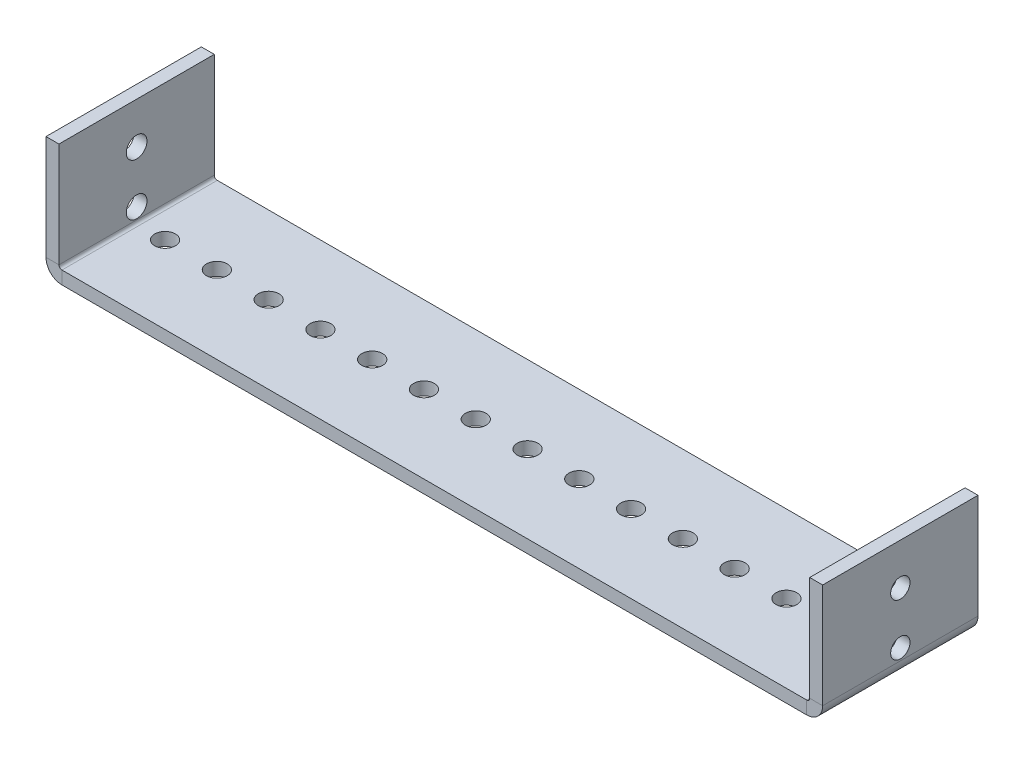
ISO-10303-21;
HEADER;
FILE_DESCRIPTION(('STEP AP214'),'2;1');
FILE_NAME('part.step','',(''),(''),'','','');
FILE_SCHEMA(('AUTOMOTIVE_DESIGN { 1 0 10303 214 1 1 1 1 }'));
ENDSEC;
DATA;
#1=APPLICATION_CONTEXT('core data for automotive mechanical design processes');
#2=APPLICATION_PROTOCOL_DEFINITION('international standard','automotive_design',2000,#1);
#3=PRODUCT_CONTEXT('',#1,'mechanical');
#4=PRODUCT('Part','Part','',(#3));
#5=PRODUCT_RELATED_PRODUCT_CATEGORY('part','',(#4));
#6=PRODUCT_DEFINITION_FORMATION('','',#4);
#7=PRODUCT_DEFINITION_CONTEXT('part definition',#1,'design');
#8=PRODUCT_DEFINITION('design','',#6,#7);
#9=PRODUCT_DEFINITION_SHAPE('','',#8);
#10=(LENGTH_UNIT() NAMED_UNIT(*) SI_UNIT(.MILLI.,.METRE.));
#11=(NAMED_UNIT(*) PLANE_ANGLE_UNIT() SI_UNIT($,.RADIAN.));
#12=(NAMED_UNIT(*) SI_UNIT($,.STERADIAN.) SOLID_ANGLE_UNIT());
#13=UNCERTAINTY_MEASURE_WITH_UNIT(LENGTH_MEASURE(1.E-05),#10,'distance_accuracy_value','');
#14=(GEOMETRIC_REPRESENTATION_CONTEXT(3) GLOBAL_UNCERTAINTY_ASSIGNED_CONTEXT((#13)) GLOBAL_UNIT_ASSIGNED_CONTEXT((#10,
#11,#12)) REPRESENTATION_CONTEXT('',''));
#15=CARTESIAN_POINT('',(0.,0.,0.));
#16=DIRECTION('',(0.,0.,1.));
#17=DIRECTION('',(1.,0.,0.));
#18=AXIS2_PLACEMENT_3D('',#15,#16,#17);
#19=CARTESIAN_POINT('',(0.,0.,0.));
#20=DIRECTION('',(0.,1.,0.));
#21=DIRECTION('',(0.,0.,1.));
#22=AXIS2_PLACEMENT_3D('',#19,#20,#21);
#23=PLANE('',#22);
#24=CARTESIAN_POINT('',(-85.09,0.,0.));
#25=DIRECTION('',(0.,1.,0.));
#26=DIRECTION('',(0.,0.,1.));
#27=AXIS2_PLACEMENT_3D('',#24,#25,#26);
#28=CIRCLE('',#27,2.54);
#29=CARTESIAN_POINT('',(-85.09,0.,2.53999999999999));
#30=VERTEX_POINT('',#29);
#31=EDGE_CURVE('E252',#30,#30,#28,.T.);
#32=ORIENTED_EDGE('',*,*,#31,.T.);
#33=EDGE_LOOP('',(#32));
#34=FACE_BOUND('',#33,.T.);
#35=CARTESIAN_POINT('',(-72.39,0.,0.));
#36=DIRECTION('',(0.,1.,0.));
#37=DIRECTION('',(0.,0.,1.));
#38=AXIS2_PLACEMENT_3D('',#35,#36,#37);
#39=CIRCLE('',#38,2.54);
#40=CARTESIAN_POINT('',(-72.39,0.,2.53999999999999));
#41=VERTEX_POINT('',#40);
#42=EDGE_CURVE('E249',#41,#41,#39,.T.);
#43=ORIENTED_EDGE('',*,*,#42,.T.);
#44=EDGE_LOOP('',(#43));
#45=FACE_BOUND('',#44,.T.);
#46=CARTESIAN_POINT('',(-59.69,0.,0.));
#47=DIRECTION('',(0.,1.,0.));
#48=DIRECTION('',(0.,0.,1.));
#49=AXIS2_PLACEMENT_3D('',#46,#47,#48);
#50=CIRCLE('',#49,2.54);
#51=CARTESIAN_POINT('',(-59.69,0.,2.53999999999999));
#52=VERTEX_POINT('',#51);
#53=EDGE_CURVE('E246',#52,#52,#50,.T.);
#54=ORIENTED_EDGE('',*,*,#53,.T.);
#55=EDGE_LOOP('',(#54));
#56=FACE_BOUND('',#55,.T.);
#57=CARTESIAN_POINT('',(-46.99,0.,0.));
#58=DIRECTION('',(0.,1.,0.));
#59=DIRECTION('',(0.,0.,1.));
#60=AXIS2_PLACEMENT_3D('',#57,#58,#59);
#61=CIRCLE('',#60,2.54);
#62=CARTESIAN_POINT('',(-46.99,0.,2.53999999999999));
#63=VERTEX_POINT('',#62);
#64=EDGE_CURVE('E243',#63,#63,#61,.T.);
#65=ORIENTED_EDGE('',*,*,#64,.T.);
#66=EDGE_LOOP('',(#65));
#67=FACE_BOUND('',#66,.T.);
#68=CARTESIAN_POINT('',(-34.29,0.,0.));
#69=DIRECTION('',(0.,1.,0.));
#70=DIRECTION('',(0.,0.,1.));
#71=AXIS2_PLACEMENT_3D('',#68,#69,#70);
#72=CIRCLE('',#71,2.54);
#73=CARTESIAN_POINT('',(-34.29,0.,2.53999999999999));
#74=VERTEX_POINT('',#73);
#75=EDGE_CURVE('E240',#74,#74,#72,.T.);
#76=ORIENTED_EDGE('',*,*,#75,.T.);
#77=EDGE_LOOP('',(#76));
#78=FACE_BOUND('',#77,.T.);
#79=CARTESIAN_POINT('',(-21.59,0.,0.));
#80=DIRECTION('',(0.,1.,0.));
#81=DIRECTION('',(0.,0.,1.));
#82=AXIS2_PLACEMENT_3D('',#79,#80,#81);
#83=CIRCLE('',#82,2.54);
#84=CARTESIAN_POINT('',(-21.59,0.,2.53999999999999));
#85=VERTEX_POINT('',#84);
#86=EDGE_CURVE('E237',#85,#85,#83,.T.);
#87=ORIENTED_EDGE('',*,*,#86,.T.);
#88=EDGE_LOOP('',(#87));
#89=FACE_BOUND('',#88,.T.);
#90=CARTESIAN_POINT('',(-8.88999999999997,0.,0.));
#91=DIRECTION('',(0.,1.,0.));
#92=DIRECTION('',(0.,0.,1.));
#93=AXIS2_PLACEMENT_3D('',#90,#91,#92);
#94=CIRCLE('',#93,2.54);
#95=CARTESIAN_POINT('',(-8.88999999999997,0.,2.53999999999999));
#96=VERTEX_POINT('',#95);
#97=EDGE_CURVE('E234',#96,#96,#94,.T.);
#98=ORIENTED_EDGE('',*,*,#97,.T.);
#99=EDGE_LOOP('',(#98));
#100=FACE_BOUND('',#99,.T.);
#101=CARTESIAN_POINT('',(3.81000000000004,0.,0.));
#102=DIRECTION('',(0.,1.,0.));
#103=DIRECTION('',(0.,0.,1.));
#104=AXIS2_PLACEMENT_3D('',#101,#102,#103);
#105=CIRCLE('',#104,2.54);
#106=CARTESIAN_POINT('',(3.81000000000004,0.,2.53999999999999));
#107=VERTEX_POINT('',#106);
#108=EDGE_CURVE('E231',#107,#107,#105,.T.);
#109=ORIENTED_EDGE('',*,*,#108,.T.);
#110=EDGE_LOOP('',(#109));
#111=FACE_BOUND('',#110,.T.);
#112=CARTESIAN_POINT('',(16.51,0.,0.));
#113=DIRECTION('',(0.,1.,0.));
#114=DIRECTION('',(0.,0.,1.));
#115=AXIS2_PLACEMENT_3D('',#112,#113,#114);
#116=CIRCLE('',#115,2.54);
#117=CARTESIAN_POINT('',(16.51,0.,2.53999999999999));
#118=VERTEX_POINT('',#117);
#119=EDGE_CURVE('E228',#118,#118,#116,.T.);
#120=ORIENTED_EDGE('',*,*,#119,.T.);
#121=EDGE_LOOP('',(#120));
#122=FACE_BOUND('',#121,.T.);
#123=CARTESIAN_POINT('',(29.21,0.,0.));
#124=DIRECTION('',(0.,1.,0.));
#125=DIRECTION('',(0.,0.,1.));
#126=AXIS2_PLACEMENT_3D('',#123,#124,#125);
#127=CIRCLE('',#126,2.54);
#128=CARTESIAN_POINT('',(29.21,0.,2.53999999999999));
#129=VERTEX_POINT('',#128);
#130=EDGE_CURVE('E225',#129,#129,#127,.T.);
#131=ORIENTED_EDGE('',*,*,#130,.T.);
#132=EDGE_LOOP('',(#131));
#133=FACE_BOUND('',#132,.T.);
#134=CARTESIAN_POINT('',(41.91,0.,0.));
#135=DIRECTION('',(0.,1.,0.));
#136=DIRECTION('',(0.,0.,1.));
#137=AXIS2_PLACEMENT_3D('',#134,#135,#136);
#138=CIRCLE('',#137,2.54);
#139=CARTESIAN_POINT('',(41.91,0.,2.53999999999999));
#140=VERTEX_POINT('',#139);
#141=EDGE_CURVE('E222',#140,#140,#138,.T.);
#142=ORIENTED_EDGE('',*,*,#141,.T.);
#143=EDGE_LOOP('',(#142));
#144=FACE_BOUND('',#143,.T.);
#145=CARTESIAN_POINT('',(54.61,0.,0.));
#146=DIRECTION('',(0.,1.,0.));
#147=DIRECTION('',(0.,0.,1.));
#148=AXIS2_PLACEMENT_3D('',#145,#146,#147);
#149=CIRCLE('',#148,2.54);
#150=CARTESIAN_POINT('',(54.61,0.,2.53999999999999));
#151=VERTEX_POINT('',#150);
#152=EDGE_CURVE('E219',#151,#151,#149,.T.);
#153=ORIENTED_EDGE('',*,*,#152,.T.);
#154=EDGE_LOOP('',(#153));
#155=FACE_BOUND('',#154,.T.);
#156=CARTESIAN_POINT('',(67.31,0.,0.));
#157=DIRECTION('',(0.,1.,0.));
#158=DIRECTION('',(0.,0.,1.));
#159=AXIS2_PLACEMENT_3D('',#156,#157,#158);
#160=CIRCLE('',#159,2.54);
#161=CARTESIAN_POINT('',(67.31,0.,2.53999999999999));
#162=VERTEX_POINT('',#161);
#163=EDGE_CURVE('E216',#162,#162,#160,.T.);
#164=ORIENTED_EDGE('',*,*,#163,.T.);
#165=EDGE_LOOP('',(#164));
#166=FACE_BOUND('',#165,.T.);
#167=CARTESIAN_POINT('',(80.01,0.,0.));
#168=DIRECTION('',(0.,1.,0.));
#169=DIRECTION('',(0.,0.,1.));
#170=AXIS2_PLACEMENT_3D('',#167,#168,#169);
#171=CIRCLE('',#170,2.54);
#172=CARTESIAN_POINT('',(80.01,0.,2.53999999999999));
#173=VERTEX_POINT('',#172);
#174=EDGE_CURVE('E213',#173,#173,#171,.T.);
#175=ORIENTED_EDGE('',*,*,#174,.T.);
#176=EDGE_LOOP('',(#175));
#177=FACE_BOUND('',#176,.T.);
#178=DIRECTION('',(1.,0.,0.));
#179=VECTOR('',#178,1.);
#180=CARTESIAN_POINT('',(-120.65,0.,-19.05));
#181=LINE('',#180,#179);
#182=CARTESIAN_POINT('',(-91.3384,0.,-19.05));
#183=VERTEX_POINT('',#182);
#184=CARTESIAN_POINT('',(91.3384,0.,-19.05));
#185=VERTEX_POINT('',#184);
#186=EDGE_CURVE('E63',#183,#185,#181,.T.);
#187=ORIENTED_EDGE('',*,*,#186,.T.);
#188=DIRECTION('',(0.,0.,1.));
#189=VECTOR('',#188,1.);
#190=CARTESIAN_POINT('',(91.3384,0.,0.));
#191=LINE('',#190,#189);
#192=CARTESIAN_POINT('',(91.3384,0.,19.05));
#193=VERTEX_POINT('',#192);
#194=EDGE_CURVE('E55',#185,#193,#191,.T.);
#195=ORIENTED_EDGE('',*,*,#194,.T.);
#196=DIRECTION('',(1.,0.,0.));
#197=VECTOR('',#196,1.);
#198=CARTESIAN_POINT('',(-120.65,0.,19.05));
#199=LINE('',#198,#197);
#200=CARTESIAN_POINT('',(-91.3384,0.,19.05));
#201=VERTEX_POINT('',#200);
#202=EDGE_CURVE('E71',#201,#193,#199,.T.);
#203=ORIENTED_EDGE('',*,*,#202,.F.);
#204=DIRECTION('',(0.,0.,1.));
#205=VECTOR('',#204,1.);
#206=CARTESIAN_POINT('',(-91.3384,0.,0.));
#207=LINE('',#206,#205);
#208=EDGE_CURVE('E204',#183,#201,#207,.T.);
#209=ORIENTED_EDGE('',*,*,#208,.F.);
#210=EDGE_LOOP('',(#187,#195,#203,#209));
#211=FACE_BOUND('',#210,.T.);
#212=ADVANCED_FACE('F46',(#34,#45,#56,#67,#78,#89,#100,#111,#122,#133,#144,#155,#166,#177,#211),
#23,.F.);
#213=CARTESIAN_POINT('',(-120.65,3.175,19.05));
#214=DIRECTION('',(0.,0.,-1.));
#215=DIRECTION('',(-1.,0.,0.));
#216=AXIS2_PLACEMENT_3D('',#213,#214,#215);
#217=PLANE('',#216);
#218=ORIENTED_EDGE('',*,*,#202,.T.);
#219=DIRECTION('',(0.,1.,0.));
#220=VECTOR('',#219,1.);
#221=CARTESIAN_POINT('',(91.3384,3.175,19.05));
#222=LINE('',#221,#220);
#223=CARTESIAN_POINT('',(91.3384,3.175,19.05));
#224=VERTEX_POINT('',#223);
#225=EDGE_CURVE('E352',#193,#224,#222,.T.);
#226=ORIENTED_EDGE('',*,*,#225,.T.);
#227=DIRECTION('',(1.,0.,0.));
#228=VECTOR('',#227,1.);
#229=CARTESIAN_POINT('',(-120.65,3.175,19.05));
#230=LINE('',#229,#228);
#231=CARTESIAN_POINT('',(-91.3384,3.175,19.05));
#232=VERTEX_POINT('',#231);
#233=EDGE_CURVE('E258',#232,#224,#230,.T.);
#234=ORIENTED_EDGE('',*,*,#233,.F.);
#235=DIRECTION('',(0.,1.,0.));
#236=VECTOR('',#235,1.);
#237=CARTESIAN_POINT('',(-91.3384,3.175,19.05));
#238=LINE('',#237,#236);
#239=EDGE_CURVE('E301',#201,#232,#238,.T.);
#240=ORIENTED_EDGE('',*,*,#239,.F.);
#241=EDGE_LOOP('',(#218,#226,#234,#240));
#242=FACE_BOUND('',#241,.T.);
#243=ADVANCED_FACE('F388',(#242),#217,.F.);
#244=CARTESIAN_POINT('',(-92.0749999999999,29.5725122568959,19.05));
#245=DIRECTION('',(0.,0.,-1.));
#246=DIRECTION('',(0.,1.,0.));
#247=AXIS2_PLACEMENT_3D('',#244,#245,#246);
#248=PLANE('',#247);
#249=DIRECTION('',(0.,-1.,0.));
#250=VECTOR('',#249,1.);
#251=CARTESIAN_POINT('',(-95.2499999999999,29.5725122568959,19.05));
#252=LINE('',#251,#250);
#253=CARTESIAN_POINT('',(-95.2499999999999,29.5725122568959,19.05));
#254=VERTEX_POINT('',#253);
#255=CARTESIAN_POINT('',(-95.25,3.91160000000002,19.05));
#256=VERTEX_POINT('',#255);
#257=EDGE_CURVE('E328',#254,#256,#252,.T.);
#258=ORIENTED_EDGE('',*,*,#257,.T.);
#259=DIRECTION('',(1.,0.,0.));
#260=VECTOR('',#259,1.);
#261=CARTESIAN_POINT('',(-92.075,3.91159999999999,19.05));
#262=LINE('',#261,#260);
#263=CARTESIAN_POINT('',(-92.075,3.91160000000001,19.05));
#264=VERTEX_POINT('',#263);
#265=EDGE_CURVE('E335',#256,#264,#262,.T.);
#266=ORIENTED_EDGE('',*,*,#265,.T.);
#267=DIRECTION('',(0.,-1.,0.));
#268=VECTOR('',#267,1.);
#269=CARTESIAN_POINT('',(-92.0749999999999,29.5725122568959,19.05));
#270=LINE('',#269,#268);
#271=CARTESIAN_POINT('',(-92.0749999999999,29.5725122568959,19.05));
#272=VERTEX_POINT('',#271);
#273=EDGE_CURVE('E323',#272,#264,#270,.T.);
#274=ORIENTED_EDGE('',*,*,#273,.F.);
#275=DIRECTION('',(-1.,0.,0.));
#276=VECTOR('',#275,1.);
#277=CARTESIAN_POINT('',(-92.0749999999999,29.5725122568959,19.05));
#278=LINE('',#277,#276);
#279=EDGE_CURVE('E322',#272,#254,#278,.T.);
#280=ORIENTED_EDGE('',*,*,#279,.T.);
#281=EDGE_LOOP('',(#258,#266,#274,#280));
#282=FACE_BOUND('',#281,.T.);
#283=ADVANCED_FACE('F393',(#282),#248,.F.);
#284=CARTESIAN_POINT('',(-95.2500000000004,-91.077487743104,0.));
#285=DIRECTION('',(1.,0.,0.));
#286=DIRECTION('',(0.,0.,1.));
#287=AXIS2_PLACEMENT_3D('',#284,#285,#286);
#288=PLANE('',#287);
#289=CARTESIAN_POINT('',(-95.25,19.4125122568959,0.));
#290=DIRECTION('',(1.,0.,0.));
#291=DIRECTION('',(0.,0.,1.));
#292=AXIS2_PLACEMENT_3D('',#289,#290,#291);
#293=CIRCLE('',#292,2.54);
#294=CARTESIAN_POINT('',(-95.25,19.4125122568959,2.53999999999999));
#295=VERTEX_POINT('',#294);
#296=EDGE_CURVE('E313',#295,#295,#293,.T.);
#297=ORIENTED_EDGE('',*,*,#296,.T.);
#298=EDGE_LOOP('',(#297));
#299=FACE_BOUND('',#298,.T.);
#300=CARTESIAN_POINT('',(-95.25,6.71251225689593,0.));
#301=DIRECTION('',(1.,0.,0.));
#302=DIRECTION('',(0.,0.,1.));
#303=AXIS2_PLACEMENT_3D('',#300,#301,#302);
#304=CIRCLE('',#303,2.54);
#305=CARTESIAN_POINT('',(-95.25,6.71251225689593,2.53999999999999));
#306=VERTEX_POINT('',#305);
#307=EDGE_CURVE('E306',#306,#306,#304,.T.);
#308=ORIENTED_EDGE('',*,*,#307,.T.);
#309=EDGE_LOOP('',(#308));
#310=FACE_BOUND('',#309,.T.);
#311=DIRECTION('',(0.,-1.,0.));
#312=VECTOR('',#311,1.);
#313=CARTESIAN_POINT('',(-95.2499999999999,29.5725122568959,-19.05));
#314=LINE('',#313,#312);
#315=CARTESIAN_POINT('',(-95.2499999999999,29.5725122568959,-19.05));
#316=VERTEX_POINT('',#315);
#317=CARTESIAN_POINT('',(-95.25,3.91160000000002,-19.05));
#318=VERTEX_POINT('',#317);
#319=EDGE_CURVE('E316',#316,#318,#314,.T.);
#320=ORIENTED_EDGE('',*,*,#319,.T.);
#321=DIRECTION('',(0.,0.,1.));
#322=VECTOR('',#321,1.);
#323=CARTESIAN_POINT('',(-95.25,3.9116,0.));
#324=LINE('',#323,#322);
#325=EDGE_CURVE('E337',#318,#256,#324,.T.);
#326=ORIENTED_EDGE('',*,*,#325,.T.);
#327=ORIENTED_EDGE('',*,*,#257,.F.);
#328=DIRECTION('',(0.,0.,-1.));
#329=VECTOR('',#328,1.);
#330=CARTESIAN_POINT('',(-95.2499999999999,29.5725122568959,19.05));
#331=LINE('',#330,#329);
#332=EDGE_CURVE('E324',#254,#316,#331,.T.);
#333=ORIENTED_EDGE('',*,*,#332,.T.);
#334=EDGE_LOOP('',(#320,#326,#327,#333));
#335=FACE_BOUND('',#334,.T.);
#336=ADVANCED_FACE('F406',(#299,#310,#335),#288,.F.);
#337=CARTESIAN_POINT('',(-92.0749999999999,29.5725122568959,-19.05));
#338=DIRECTION('',(0.,0.,-1.));
#339=DIRECTION('',(0.,1.,0.));
#340=AXIS2_PLACEMENT_3D('',#337,#338,#339);
#341=PLANE('',#340);
#342=DIRECTION('',(1.,0.,0.));
#343=VECTOR('',#342,1.);
#344=CARTESIAN_POINT('',(-92.075,3.91159999999999,-19.05));
#345=LINE('',#344,#343);
#346=CARTESIAN_POINT('',(-92.075,3.9116,-19.05));
#347=VERTEX_POINT('',#346);
#348=EDGE_CURVE('E340',#318,#347,#345,.T.);
#349=ORIENTED_EDGE('',*,*,#348,.F.);
#350=ORIENTED_EDGE('',*,*,#319,.F.);
#351=DIRECTION('',(-1.,0.,0.));
#352=VECTOR('',#351,1.);
#353=CARTESIAN_POINT('',(-92.0749999999999,29.5725122568959,-19.05));
#354=LINE('',#353,#352);
#355=CARTESIAN_POINT('',(-92.0749999999999,29.5725122568959,-19.05));
#356=VERTEX_POINT('',#355);
#357=EDGE_CURVE('E329',#356,#316,#354,.T.);
#358=ORIENTED_EDGE('',*,*,#357,.F.);
#359=DIRECTION('',(0.,-1.,0.));
#360=VECTOR('',#359,1.);
#361=CARTESIAN_POINT('',(-92.0749999999999,29.5725122568959,-19.05));
#362=LINE('',#361,#360);
#363=EDGE_CURVE('E327',#356,#347,#362,.T.);
#364=ORIENTED_EDGE('',*,*,#363,.T.);
#365=EDGE_LOOP('',(#349,#350,#358,#364));
#366=FACE_BOUND('',#365,.T.);
#367=ADVANCED_FACE('F402',(#366),#341,.T.);
#368=CARTESIAN_POINT('',(-92.0749999999999,29.5725122568959,19.05));
#369=DIRECTION('',(0.,1.,0.));
#370=DIRECTION('',(0.,0.,1.));
#371=AXIS2_PLACEMENT_3D('',#368,#369,#370);
#372=PLANE('',#371);
#373=ORIENTED_EDGE('',*,*,#332,.F.);
#374=ORIENTED_EDGE('',*,*,#279,.F.);
#375=DIRECTION('',(0.,0.,-1.));
#376=VECTOR('',#375,1.);
#377=CARTESIAN_POINT('',(-92.0749999999999,29.5725122568959,19.05));
#378=LINE('',#377,#376);
#379=EDGE_CURVE('E319',#272,#356,#378,.T.);
#380=ORIENTED_EDGE('',*,*,#379,.T.);
#381=ORIENTED_EDGE('',*,*,#357,.T.);
#382=EDGE_LOOP('',(#373,#374,#380,#381));
#383=FACE_BOUND('',#382,.T.);
#384=ADVANCED_FACE('F405',(#383),#372,.T.);
#385=CARTESIAN_POINT('',(-92.0750000000004,-91.077487743104,0.));
#386=DIRECTION('',(1.,0.,0.));
#387=DIRECTION('',(0.,0.,1.));
#388=AXIS2_PLACEMENT_3D('',#385,#386,#387);
#389=PLANE('',#388);
#390=DIRECTION('',(0.,0.,1.));
#391=VECTOR('',#390,1.);
#392=CARTESIAN_POINT('',(-92.075,3.91159999999999,0.));
#393=LINE('',#392,#391);
#394=EDGE_CURVE('E331',#347,#264,#393,.T.);
#395=ORIENTED_EDGE('',*,*,#394,.F.);
#396=ORIENTED_EDGE('',*,*,#363,.F.);
#397=ORIENTED_EDGE('',*,*,#379,.F.);
#398=ORIENTED_EDGE('',*,*,#273,.T.);
#399=EDGE_LOOP('',(#395,#396,#397,#398));
#400=FACE_BOUND('',#399,.T.);
#401=CARTESIAN_POINT('',(-92.075,6.71251225689591,0.));
#402=DIRECTION('',(1.,0.,0.));
#403=DIRECTION('',(0.,0.,1.));
#404=AXIS2_PLACEMENT_3D('',#401,#402,#403);
#405=CIRCLE('',#404,2.54);
#406=CARTESIAN_POINT('',(-92.075,6.71251225689591,2.53999999999999));
#407=VERTEX_POINT('',#406);
#408=EDGE_CURVE('E309',#407,#407,#405,.T.);
#409=ORIENTED_EDGE('',*,*,#408,.F.);
#410=EDGE_LOOP('',(#409));
#411=FACE_BOUND('',#410,.T.);
#412=CARTESIAN_POINT('',(-92.075,19.4125122568959,0.));
#413=DIRECTION('',(1.,0.,0.));
#414=DIRECTION('',(0.,0.,1.));
#415=AXIS2_PLACEMENT_3D('',#412,#413,#414);
#416=CIRCLE('',#415,2.54);
#417=CARTESIAN_POINT('',(-92.075,19.4125122568959,2.53999999999999));
#418=VERTEX_POINT('',#417);
#419=EDGE_CURVE('E312',#418,#418,#416,.T.);
#420=ORIENTED_EDGE('',*,*,#419,.F.);
#421=EDGE_LOOP('',(#420));
#422=FACE_BOUND('',#421,.T.);
#423=ADVANCED_FACE('F414',(#400,#411,#422),#389,.T.);
#424=CARTESIAN_POINT('',(-95.25,19.4125122568959,0.));
#425=DIRECTION('',(1.,0.,0.));
#426=DIRECTION('',(0.,0.,1.));
#427=AXIS2_PLACEMENT_3D('',#424,#425,#426);
#428=CYLINDRICAL_SURFACE('',#427,2.54);
#429=ORIENTED_EDGE('',*,*,#296,.F.);
#430=EDGE_LOOP('',(#429));
#431=FACE_BOUND('',#430,.T.);
#432=ORIENTED_EDGE('',*,*,#419,.T.);
#433=EDGE_LOOP('',(#432));
#434=FACE_BOUND('',#433,.T.);
#435=ADVANCED_FACE('F417',(#431,#434),#428,.F.);
#436=CARTESIAN_POINT('',(-95.25,6.71251225689593,0.));
#437=DIRECTION('',(1.,0.,0.));
#438=DIRECTION('',(0.,0.,1.));
#439=AXIS2_PLACEMENT_3D('',#436,#437,#438);
#440=CYLINDRICAL_SURFACE('',#439,2.54);
#441=ORIENTED_EDGE('',*,*,#307,.F.);
#442=EDGE_LOOP('',(#441));
#443=FACE_BOUND('',#442,.T.);
#444=ORIENTED_EDGE('',*,*,#408,.T.);
#445=EDGE_LOOP('',(#444));
#446=FACE_BOUND('',#445,.T.);
#447=ADVANCED_FACE('F424',(#443,#446),#440,.F.);
#448=CARTESIAN_POINT('',(-85.09,0.,0.));
#449=DIRECTION('',(0.,1.,0.));
#450=DIRECTION('',(0.,0.,1.));
#451=AXIS2_PLACEMENT_3D('',#448,#449,#450);
#452=CYLINDRICAL_SURFACE('',#451,2.54);
#453=ORIENTED_EDGE('',*,*,#31,.F.);
#454=EDGE_LOOP('',(#453));
#455=FACE_BOUND('',#454,.T.);
#456=CARTESIAN_POINT('',(-85.09,3.175,0.));
#457=DIRECTION('',(0.,1.,0.));
#458=DIRECTION('',(0.,0.,1.));
#459=AXIS2_PLACEMENT_3D('',#456,#457,#458);
#460=CIRCLE('',#459,2.54);
#461=CARTESIAN_POINT('',(-85.09,3.175,2.53999999999999));
#462=VERTEX_POINT('',#461);
#463=EDGE_CURVE('E298',#462,#462,#460,.T.);
#464=ORIENTED_EDGE('',*,*,#463,.T.);
#465=EDGE_LOOP('',(#464));
#466=FACE_BOUND('',#465,.T.);
#467=ADVANCED_FACE('F428',(#455,#466),#452,.F.);
#468=CARTESIAN_POINT('',(-72.39,0.,0.));
#469=DIRECTION('',(0.,1.,0.));
#470=DIRECTION('',(0.,0.,1.));
#471=AXIS2_PLACEMENT_3D('',#468,#469,#470);
#472=CYLINDRICAL_SURFACE('',#471,2.54);
#473=ORIENTED_EDGE('',*,*,#42,.F.);
#474=EDGE_LOOP('',(#473));
#475=FACE_BOUND('',#474,.T.);
#476=CARTESIAN_POINT('',(-72.39,3.175,0.));
#477=DIRECTION('',(0.,1.,0.));
#478=DIRECTION('',(0.,0.,1.));
#479=AXIS2_PLACEMENT_3D('',#476,#477,#478);
#480=CIRCLE('',#479,2.54);
#481=CARTESIAN_POINT('',(-72.39,3.175,2.53999999999999));
#482=VERTEX_POINT('',#481);
#483=EDGE_CURVE('E295',#482,#482,#480,.T.);
#484=ORIENTED_EDGE('',*,*,#483,.T.);
#485=EDGE_LOOP('',(#484));
#486=FACE_BOUND('',#485,.T.);
#487=ADVANCED_FACE('F476',(#475,#486),#472,.F.);
#488=CARTESIAN_POINT('',(-59.69,0.,0.));
#489=DIRECTION('',(0.,1.,0.));
#490=DIRECTION('',(0.,0.,1.));
#491=AXIS2_PLACEMENT_3D('',#488,#489,#490);
#492=CYLINDRICAL_SURFACE('',#491,2.54);
#493=ORIENTED_EDGE('',*,*,#53,.F.);
#494=EDGE_LOOP('',(#493));
#495=FACE_BOUND('',#494,.T.);
#496=CARTESIAN_POINT('',(-59.69,3.175,0.));
#497=DIRECTION('',(0.,1.,0.));
#498=DIRECTION('',(0.,0.,1.));
#499=AXIS2_PLACEMENT_3D('',#496,#497,#498);
#500=CIRCLE('',#499,2.54);
#501=CARTESIAN_POINT('',(-59.69,3.175,2.53999999999999));
#502=VERTEX_POINT('',#501);
#503=EDGE_CURVE('E292',#502,#502,#500,.T.);
#504=ORIENTED_EDGE('',*,*,#503,.T.);
#505=EDGE_LOOP('',(#504));
#506=FACE_BOUND('',#505,.T.);
#507=ADVANCED_FACE('F472',(#495,#506),#492,.F.);
#508=CARTESIAN_POINT('',(-46.99,0.,0.));
#509=DIRECTION('',(0.,1.,0.));
#510=DIRECTION('',(0.,0.,1.));
#511=AXIS2_PLACEMENT_3D('',#508,#509,#510);
#512=CYLINDRICAL_SURFACE('',#511,2.54);
#513=ORIENTED_EDGE('',*,*,#64,.F.);
#514=EDGE_LOOP('',(#513));
#515=FACE_BOUND('',#514,.T.);
#516=CARTESIAN_POINT('',(-46.99,3.175,0.));
#517=DIRECTION('',(0.,1.,0.));
#518=DIRECTION('',(0.,0.,1.));
#519=AXIS2_PLACEMENT_3D('',#516,#517,#518);
#520=CIRCLE('',#519,2.54);
#521=CARTESIAN_POINT('',(-46.99,3.175,2.53999999999999));
#522=VERTEX_POINT('',#521);
#523=EDGE_CURVE('E289',#522,#522,#520,.T.);
#524=ORIENTED_EDGE('',*,*,#523,.T.);
#525=EDGE_LOOP('',(#524));
#526=FACE_BOUND('',#525,.T.);
#527=ADVANCED_FACE('F468',(#515,#526),#512,.F.);
#528=CARTESIAN_POINT('',(-34.29,0.,0.));
#529=DIRECTION('',(0.,1.,0.));
#530=DIRECTION('',(0.,0.,1.));
#531=AXIS2_PLACEMENT_3D('',#528,#529,#530);
#532=CYLINDRICAL_SURFACE('',#531,2.54);
#533=ORIENTED_EDGE('',*,*,#75,.F.);
#534=EDGE_LOOP('',(#533));
#535=FACE_BOUND('',#534,.T.);
#536=CARTESIAN_POINT('',(-34.29,3.175,0.));
#537=DIRECTION('',(0.,1.,0.));
#538=DIRECTION('',(0.,0.,1.));
#539=AXIS2_PLACEMENT_3D('',#536,#537,#538);
#540=CIRCLE('',#539,2.54);
#541=CARTESIAN_POINT('',(-34.29,3.175,2.53999999999999));
#542=VERTEX_POINT('',#541);
#543=EDGE_CURVE('E286',#542,#542,#540,.T.);
#544=ORIENTED_EDGE('',*,*,#543,.T.);
#545=EDGE_LOOP('',(#544));
#546=FACE_BOUND('',#545,.T.);
#547=ADVANCED_FACE('F464',(#535,#546),#532,.F.);
#548=CARTESIAN_POINT('',(-21.59,0.,0.));
#549=DIRECTION('',(0.,1.,0.));
#550=DIRECTION('',(0.,0.,1.));
#551=AXIS2_PLACEMENT_3D('',#548,#549,#550);
#552=CYLINDRICAL_SURFACE('',#551,2.54);
#553=ORIENTED_EDGE('',*,*,#86,.F.);
#554=EDGE_LOOP('',(#553));
#555=FACE_BOUND('',#554,.T.);
#556=CARTESIAN_POINT('',(-21.59,3.175,0.));
#557=DIRECTION('',(0.,1.,0.));
#558=DIRECTION('',(0.,0.,1.));
#559=AXIS2_PLACEMENT_3D('',#556,#557,#558);
#560=CIRCLE('',#559,2.54);
#561=CARTESIAN_POINT('',(-21.59,3.175,2.53999999999999));
#562=VERTEX_POINT('',#561);
#563=EDGE_CURVE('E283',#562,#562,#560,.T.);
#564=ORIENTED_EDGE('',*,*,#563,.T.);
#565=EDGE_LOOP('',(#564));
#566=FACE_BOUND('',#565,.T.);
#567=ADVANCED_FACE('F460',(#555,#566),#552,.F.);
#568=CARTESIAN_POINT('',(-8.88999999999997,0.,0.));
#569=DIRECTION('',(0.,1.,0.));
#570=DIRECTION('',(0.,0.,1.));
#571=AXIS2_PLACEMENT_3D('',#568,#569,#570);
#572=CYLINDRICAL_SURFACE('',#571,2.54);
#573=ORIENTED_EDGE('',*,*,#97,.F.);
#574=EDGE_LOOP('',(#573));
#575=FACE_BOUND('',#574,.T.);
#576=CARTESIAN_POINT('',(-8.88999999999997,3.175,0.));
#577=DIRECTION('',(0.,1.,0.));
#578=DIRECTION('',(0.,0.,1.));
#579=AXIS2_PLACEMENT_3D('',#576,#577,#578);
#580=CIRCLE('',#579,2.54);
#581=CARTESIAN_POINT('',(-8.88999999999997,3.175,2.53999999999999));
#582=VERTEX_POINT('',#581);
#583=EDGE_CURVE('E280',#582,#582,#580,.T.);
#584=ORIENTED_EDGE('',*,*,#583,.T.);
#585=EDGE_LOOP('',(#584));
#586=FACE_BOUND('',#585,.T.);
#587=ADVANCED_FACE('F456',(#575,#586),#572,.F.);
#588=CARTESIAN_POINT('',(3.81000000000004,0.,0.));
#589=DIRECTION('',(0.,1.,0.));
#590=DIRECTION('',(0.,0.,1.));
#591=AXIS2_PLACEMENT_3D('',#588,#589,#590);
#592=CYLINDRICAL_SURFACE('',#591,2.54);
#593=ORIENTED_EDGE('',*,*,#108,.F.);
#594=EDGE_LOOP('',(#593));
#595=FACE_BOUND('',#594,.T.);
#596=CARTESIAN_POINT('',(3.81000000000004,3.175,0.));
#597=DIRECTION('',(0.,1.,0.));
#598=DIRECTION('',(0.,0.,1.));
#599=AXIS2_PLACEMENT_3D('',#596,#597,#598);
#600=CIRCLE('',#599,2.54);
#601=CARTESIAN_POINT('',(3.81000000000004,3.175,2.53999999999999));
#602=VERTEX_POINT('',#601);
#603=EDGE_CURVE('E277',#602,#602,#600,.T.);
#604=ORIENTED_EDGE('',*,*,#603,.T.);
#605=EDGE_LOOP('',(#604));
#606=FACE_BOUND('',#605,.T.);
#607=ADVANCED_FACE('F452',(#595,#606),#592,.F.);
#608=CARTESIAN_POINT('',(16.51,0.,0.));
#609=DIRECTION('',(0.,1.,0.));
#610=DIRECTION('',(0.,0.,1.));
#611=AXIS2_PLACEMENT_3D('',#608,#609,#610);
#612=CYLINDRICAL_SURFACE('',#611,2.54);
#613=ORIENTED_EDGE('',*,*,#119,.F.);
#614=EDGE_LOOP('',(#613));
#615=FACE_BOUND('',#614,.T.);
#616=CARTESIAN_POINT('',(16.51,3.175,0.));
#617=DIRECTION('',(0.,1.,0.));
#618=DIRECTION('',(0.,0.,1.));
#619=AXIS2_PLACEMENT_3D('',#616,#617,#618);
#620=CIRCLE('',#619,2.54);
#621=CARTESIAN_POINT('',(16.51,3.175,2.53999999999999));
#622=VERTEX_POINT('',#621);
#623=EDGE_CURVE('E274',#622,#622,#620,.T.);
#624=ORIENTED_EDGE('',*,*,#623,.T.);
#625=EDGE_LOOP('',(#624));
#626=FACE_BOUND('',#625,.T.);
#627=ADVANCED_FACE('F448',(#615,#626),#612,.F.);
#628=CARTESIAN_POINT('',(29.21,0.,0.));
#629=DIRECTION('',(0.,1.,0.));
#630=DIRECTION('',(0.,0.,1.));
#631=AXIS2_PLACEMENT_3D('',#628,#629,#630);
#632=CYLINDRICAL_SURFACE('',#631,2.54);
#633=ORIENTED_EDGE('',*,*,#130,.F.);
#634=EDGE_LOOP('',(#633));
#635=FACE_BOUND('',#634,.T.);
#636=CARTESIAN_POINT('',(29.21,3.175,0.));
#637=DIRECTION('',(0.,1.,0.));
#638=DIRECTION('',(0.,0.,1.));
#639=AXIS2_PLACEMENT_3D('',#636,#637,#638);
#640=CIRCLE('',#639,2.54);
#641=CARTESIAN_POINT('',(29.21,3.175,2.53999999999999));
#642=VERTEX_POINT('',#641);
#643=EDGE_CURVE('E271',#642,#642,#640,.T.);
#644=ORIENTED_EDGE('',*,*,#643,.T.);
#645=EDGE_LOOP('',(#644));
#646=FACE_BOUND('',#645,.T.);
#647=ADVANCED_FACE('F444',(#635,#646),#632,.F.);
#648=CARTESIAN_POINT('',(41.91,0.,0.));
#649=DIRECTION('',(0.,1.,0.));
#650=DIRECTION('',(0.,0.,1.));
#651=AXIS2_PLACEMENT_3D('',#648,#649,#650);
#652=CYLINDRICAL_SURFACE('',#651,2.54);
#653=ORIENTED_EDGE('',*,*,#141,.F.);
#654=EDGE_LOOP('',(#653));
#655=FACE_BOUND('',#654,.T.);
#656=CARTESIAN_POINT('',(41.91,3.175,0.));
#657=DIRECTION('',(0.,1.,0.));
#658=DIRECTION('',(0.,0.,1.));
#659=AXIS2_PLACEMENT_3D('',#656,#657,#658);
#660=CIRCLE('',#659,2.54);
#661=CARTESIAN_POINT('',(41.91,3.175,2.53999999999999));
#662=VERTEX_POINT('',#661);
#663=EDGE_CURVE('E268',#662,#662,#660,.T.);
#664=ORIENTED_EDGE('',*,*,#663,.T.);
#665=EDGE_LOOP('',(#664));
#666=FACE_BOUND('',#665,.T.);
#667=ADVANCED_FACE('F440',(#655,#666),#652,.F.);
#668=CARTESIAN_POINT('',(54.61,0.,0.));
#669=DIRECTION('',(0.,1.,0.));
#670=DIRECTION('',(0.,0.,1.));
#671=AXIS2_PLACEMENT_3D('',#668,#669,#670);
#672=CYLINDRICAL_SURFACE('',#671,2.54);
#673=ORIENTED_EDGE('',*,*,#152,.F.);
#674=EDGE_LOOP('',(#673));
#675=FACE_BOUND('',#674,.T.);
#676=CARTESIAN_POINT('',(54.61,3.175,0.));
#677=DIRECTION('',(0.,1.,0.));
#678=DIRECTION('',(0.,0.,1.));
#679=AXIS2_PLACEMENT_3D('',#676,#677,#678);
#680=CIRCLE('',#679,2.54);
#681=CARTESIAN_POINT('',(54.61,3.175,2.53999999999999));
#682=VERTEX_POINT('',#681);
#683=EDGE_CURVE('E265',#682,#682,#680,.T.);
#684=ORIENTED_EDGE('',*,*,#683,.T.);
#685=EDGE_LOOP('',(#684));
#686=FACE_BOUND('',#685,.T.);
#687=ADVANCED_FACE('F436',(#675,#686),#672,.F.);
#688=CARTESIAN_POINT('',(67.31,0.,0.));
#689=DIRECTION('',(0.,1.,0.));
#690=DIRECTION('',(0.,0.,1.));
#691=AXIS2_PLACEMENT_3D('',#688,#689,#690);
#692=CYLINDRICAL_SURFACE('',#691,2.54);
#693=ORIENTED_EDGE('',*,*,#163,.F.);
#694=EDGE_LOOP('',(#693));
#695=FACE_BOUND('',#694,.T.);
#696=CARTESIAN_POINT('',(67.31,3.175,0.));
#697=DIRECTION('',(0.,1.,0.));
#698=DIRECTION('',(0.,0.,1.));
#699=AXIS2_PLACEMENT_3D('',#696,#697,#698);
#700=CIRCLE('',#699,2.54);
#701=CARTESIAN_POINT('',(67.31,3.175,2.53999999999999));
#702=VERTEX_POINT('',#701);
#703=EDGE_CURVE('E262',#702,#702,#700,.T.);
#704=ORIENTED_EDGE('',*,*,#703,.T.);
#705=EDGE_LOOP('',(#704));
#706=FACE_BOUND('',#705,.T.);
#707=ADVANCED_FACE('F432',(#695,#706),#692,.F.);
#708=CARTESIAN_POINT('',(80.01,0.,0.));
#709=DIRECTION('',(0.,1.,0.));
#710=DIRECTION('',(0.,0.,1.));
#711=AXIS2_PLACEMENT_3D('',#708,#709,#710);
#712=CYLINDRICAL_SURFACE('',#711,2.54);
#713=ORIENTED_EDGE('',*,*,#174,.F.);
#714=EDGE_LOOP('',(#713));
#715=FACE_BOUND('',#714,.T.);
#716=CARTESIAN_POINT('',(80.01,3.175,0.));
#717=DIRECTION('',(0.,1.,0.));
#718=DIRECTION('',(0.,0.,1.));
#719=AXIS2_PLACEMENT_3D('',#716,#717,#718);
#720=CIRCLE('',#719,2.54);
#721=CARTESIAN_POINT('',(80.01,3.175,2.53999999999999));
#722=VERTEX_POINT('',#721);
#723=EDGE_CURVE('E259',#722,#722,#720,.T.);
#724=ORIENTED_EDGE('',*,*,#723,.T.);
#725=EDGE_LOOP('',(#724));
#726=FACE_BOUND('',#725,.T.);
#727=ADVANCED_FACE('F400',(#715,#726),#712,.F.);
#728=CARTESIAN_POINT('',(0.,3.175,0.));
#729=DIRECTION('',(0.,1.,0.));
#730=DIRECTION('',(0.,0.,1.));
#731=AXIS2_PLACEMENT_3D('',#728,#729,#730);
#732=PLANE('',#731);
#733=DIRECTION('',(0.,0.,1.));
#734=VECTOR('',#733,1.);
#735=CARTESIAN_POINT('',(91.3384,3.175,0.));
#736=LINE('',#735,#734);
#737=CARTESIAN_POINT('',(91.3384,3.175,-19.05));
#738=VERTEX_POINT('',#737);
#739=EDGE_CURVE('E343',#738,#224,#736,.T.);
#740=ORIENTED_EDGE('',*,*,#739,.F.);
#741=DIRECTION('',(1.,0.,0.));
#742=VECTOR('',#741,1.);
#743=CARTESIAN_POINT('',(-120.65,3.175,-19.05));
#744=LINE('',#743,#742);
#745=CARTESIAN_POINT('',(-91.3384,3.175,-19.05));
#746=VERTEX_POINT('',#745);
#747=EDGE_CURVE('E212',#746,#738,#744,.T.);
#748=ORIENTED_EDGE('',*,*,#747,.F.);
#749=DIRECTION('',(0.,0.,1.));
#750=VECTOR('',#749,1.);
#751=CARTESIAN_POINT('',(-91.3384,3.175,0.));
#752=LINE('',#751,#750);
#753=EDGE_CURVE('E255',#746,#232,#752,.T.);
#754=ORIENTED_EDGE('',*,*,#753,.T.);
#755=ORIENTED_EDGE('',*,*,#233,.T.);
#756=EDGE_LOOP('',(#740,#748,#754,#755));
#757=FACE_BOUND('',#756,.T.);
#758=ORIENTED_EDGE('',*,*,#723,.F.);
#759=EDGE_LOOP('',(#758));
#760=FACE_BOUND('',#759,.T.);
#761=ORIENTED_EDGE('',*,*,#703,.F.);
#762=EDGE_LOOP('',(#761));
#763=FACE_BOUND('',#762,.T.);
#764=ORIENTED_EDGE('',*,*,#683,.F.);
#765=EDGE_LOOP('',(#764));
#766=FACE_BOUND('',#765,.T.);
#767=ORIENTED_EDGE('',*,*,#663,.F.);
#768=EDGE_LOOP('',(#767));
#769=FACE_BOUND('',#768,.T.);
#770=ORIENTED_EDGE('',*,*,#643,.F.);
#771=EDGE_LOOP('',(#770));
#772=FACE_BOUND('',#771,.T.);
#773=ORIENTED_EDGE('',*,*,#623,.F.);
#774=EDGE_LOOP('',(#773));
#775=FACE_BOUND('',#774,.T.);
#776=ORIENTED_EDGE('',*,*,#603,.F.);
#777=EDGE_LOOP('',(#776));
#778=FACE_BOUND('',#777,.T.);
#779=ORIENTED_EDGE('',*,*,#583,.F.);
#780=EDGE_LOOP('',(#779));
#781=FACE_BOUND('',#780,.T.);
#782=ORIENTED_EDGE('',*,*,#563,.F.);
#783=EDGE_LOOP('',(#782));
#784=FACE_BOUND('',#783,.T.);
#785=ORIENTED_EDGE('',*,*,#543,.F.);
#786=EDGE_LOOP('',(#785));
#787=FACE_BOUND('',#786,.T.);
#788=ORIENTED_EDGE('',*,*,#523,.F.);
#789=EDGE_LOOP('',(#788));
#790=FACE_BOUND('',#789,.T.);
#791=ORIENTED_EDGE('',*,*,#503,.F.);
#792=EDGE_LOOP('',(#791));
#793=FACE_BOUND('',#792,.T.);
#794=ORIENTED_EDGE('',*,*,#483,.F.);
#795=EDGE_LOOP('',(#794));
#796=FACE_BOUND('',#795,.T.);
#797=ORIENTED_EDGE('',*,*,#463,.F.);
#798=EDGE_LOOP('',(#797));
#799=FACE_BOUND('',#798,.T.);
#800=ADVANCED_FACE('F397',(#757,#760,#763,#766,#769,#772,#775,#778,#781,#784,#787,#790,#793,
#796,#799),#732,.T.);
#801=CARTESIAN_POINT('',(-120.65,3.175,-19.05));
#802=DIRECTION('',(0.,0.,-1.));
#803=DIRECTION('',(-1.,0.,0.));
#804=AXIS2_PLACEMENT_3D('',#801,#802,#803);
#805=PLANE('',#804);
#806=DIRECTION('',(0.,1.,0.));
#807=VECTOR('',#806,1.);
#808=CARTESIAN_POINT('',(91.3384,3.175,-19.05));
#809=LINE('',#808,#807);
#810=EDGE_CURVE('E12',#185,#738,#809,.T.);
#811=ORIENTED_EDGE('',*,*,#810,.F.);
#812=ORIENTED_EDGE('',*,*,#186,.F.);
#813=DIRECTION('',(0.,1.,0.));
#814=VECTOR('',#813,1.);
#815=CARTESIAN_POINT('',(-91.3384,3.175,-19.05));
#816=LINE('',#815,#814);
#817=EDGE_CURVE('E209',#183,#746,#816,.T.);
#818=ORIENTED_EDGE('',*,*,#817,.T.);
#819=ORIENTED_EDGE('',*,*,#747,.T.);
#820=EDGE_LOOP('',(#811,#812,#818,#819));
#821=FACE_BOUND('',#820,.T.);
#822=ADVANCED_FACE('F48',(#821),#805,.T.);
#823=CARTESIAN_POINT('',(-91.3384,3.9116,-19.05));
#824=DIRECTION('',(0.,0.,1.));
#825=DIRECTION('',(1.,0.,0.));
#826=AXIS2_PLACEMENT_3D('',#823,#824,#825);
#827=PLANE('',#826);
#828=ORIENTED_EDGE('',*,*,#817,.F.);
#829=CARTESIAN_POINT('',(-91.3384,3.9116,-19.05));
#830=DIRECTION('',(0.,0.,1.));
#831=DIRECTION('',(1.,0.,0.));
#832=AXIS2_PLACEMENT_3D('',#829,#830,#831);
#833=CIRCLE('',#832,3.9116);
#834=EDGE_CURVE('E193',#183,#318,#833,.F.);
#835=ORIENTED_EDGE('',*,*,#834,.T.);
#836=ORIENTED_EDGE('',*,*,#348,.T.);
#837=CARTESIAN_POINT('',(-91.3384,3.9116,-19.05));
#838=DIRECTION('',(0.,0.,-1.));
#839=DIRECTION('',(1.,0.,0.));
#840=AXIS2_PLACEMENT_3D('',#837,#838,#839);
#841=CIRCLE('',#840,0.736600000000002);
#842=EDGE_CURVE('E197',#746,#347,#841,.T.);
#843=ORIENTED_EDGE('',*,*,#842,.F.);
#844=EDGE_LOOP('',(#828,#835,#836,#843));
#845=FACE_BOUND('',#844,.T.);
#846=ADVANCED_FACE('F484',(#845),#827,.F.);
#847=CARTESIAN_POINT('',(-91.3384,3.9116,19.05));
#848=DIRECTION('',(0.,0.,-1.));
#849=DIRECTION('',(-1.,0.,0.));
#850=AXIS2_PLACEMENT_3D('',#847,#848,#849);
#851=PLANE('',#850);
#852=ORIENTED_EDGE('',*,*,#265,.F.);
#853=CARTESIAN_POINT('',(-91.3384,3.9116,19.05));
#854=DIRECTION('',(0.,0.,1.));
#855=DIRECTION('',(1.,0.,0.));
#856=AXIS2_PLACEMENT_3D('',#853,#854,#855);
#857=CIRCLE('',#856,3.9116);
#858=EDGE_CURVE('E201',#256,#201,#857,.T.);
#859=ORIENTED_EDGE('',*,*,#858,.T.);
#860=ORIENTED_EDGE('',*,*,#239,.T.);
#861=CARTESIAN_POINT('',(-91.3384,3.9116,19.05));
#862=DIRECTION('',(0.,0.,1.));
#863=DIRECTION('',(1.,0.,0.));
#864=AXIS2_PLACEMENT_3D('',#861,#862,#863);
#865=CIRCLE('',#864,0.736600000000002);
#866=EDGE_CURVE('E200',#264,#232,#865,.T.);
#867=ORIENTED_EDGE('',*,*,#866,.F.);
#868=EDGE_LOOP('',(#852,#859,#860,#867));
#869=FACE_BOUND('',#868,.T.);
#870=ADVANCED_FACE('F487',(#869),#851,.F.);
#871=CARTESIAN_POINT('',(-91.3384,3.9116,-38.4059649793837));
#872=DIRECTION('',(0.,0.,1.));
#873=DIRECTION('',(1.,0.,0.));
#874=AXIS2_PLACEMENT_3D('',#871,#872,#873);
#875=CYLINDRICAL_SURFACE('',#874,0.7366);
#876=ORIENTED_EDGE('',*,*,#866,.T.);
#877=ORIENTED_EDGE('',*,*,#753,.F.);
#878=ORIENTED_EDGE('',*,*,#842,.T.);
#879=ORIENTED_EDGE('',*,*,#394,.T.);
#880=EDGE_LOOP('',(#876,#877,#878,#879));
#881=FACE_BOUND('',#880,.T.);
#882=ADVANCED_FACE('F491',(#881),#875,.F.);
#883=CARTESIAN_POINT('',(-91.3384,3.9116,-38.4059649793837));
#884=DIRECTION('',(0.,0.,1.));
#885=DIRECTION('',(1.,0.,0.));
#886=AXIS2_PLACEMENT_3D('',#883,#884,#885);
#887=CYLINDRICAL_SURFACE('',#886,3.9116);
#888=ORIENTED_EDGE('',*,*,#858,.F.);
#889=ORIENTED_EDGE('',*,*,#325,.F.);
#890=ORIENTED_EDGE('',*,*,#834,.F.);
#891=ORIENTED_EDGE('',*,*,#208,.T.);
#892=EDGE_LOOP('',(#888,#889,#890,#891));
#893=FACE_BOUND('',#892,.T.);
#894=ADVANCED_FACE('F493',(#893),#887,.T.);
#895=CARTESIAN_POINT('',(91.3384,3.9116,19.05));
#896=DIRECTION('',(0.,0.,-1.));
#897=DIRECTION('',(-1.,0.,0.));
#898=AXIS2_PLACEMENT_3D('',#895,#896,#897);
#899=PLANE('',#898);
#900=ORIENTED_EDGE('',*,*,#225,.F.);
#901=CARTESIAN_POINT('',(91.3384,3.9116,19.05));
#902=DIRECTION('',(0.,0.,-1.));
#903=DIRECTION('',(-1.,0.,0.));
#904=AXIS2_PLACEMENT_3D('',#901,#902,#903);
#905=CIRCLE('',#904,3.9116);
#906=CARTESIAN_POINT('',(95.25,3.91160000000002,19.05));
#907=VERTEX_POINT('',#906);
#908=EDGE_CURVE('E162',#193,#907,#905,.F.);
#909=ORIENTED_EDGE('',*,*,#908,.T.);
#910=DIRECTION('',(-1.,0.,0.));
#911=VECTOR('',#910,1.);
#912=CARTESIAN_POINT('',(92.075,3.91160000000006,19.05));
#913=LINE('',#912,#911);
#914=CARTESIAN_POINT('',(92.075,3.91160000000002,19.05));
#915=VERTEX_POINT('',#914);
#916=EDGE_CURVE('E181',#907,#915,#913,.T.);
#917=ORIENTED_EDGE('',*,*,#916,.T.);
#918=CARTESIAN_POINT('',(91.3384,3.9116,19.05));
#919=DIRECTION('',(0.,0.,-1.));
#920=DIRECTION('',(-1.,0.,0.));
#921=AXIS2_PLACEMENT_3D('',#918,#919,#920);
#922=CIRCLE('',#921,0.7366);
#923=EDGE_CURVE('E188',#224,#915,#922,.F.);
#924=ORIENTED_EDGE('',*,*,#923,.F.);
#925=EDGE_LOOP('',(#900,#909,#917,#924));
#926=FACE_BOUND('',#925,.T.);
#927=ADVANCED_FACE('F496',(#926),#899,.F.);
#928=CARTESIAN_POINT('',(91.3384,3.9116,-19.05));
#929=DIRECTION('',(0.,0.,1.));
#930=DIRECTION('',(1.,0.,0.));
#931=AXIS2_PLACEMENT_3D('',#928,#929,#930);
#932=PLANE('',#931);
#933=CARTESIAN_POINT('',(91.3384,3.9116,-19.05));
#934=DIRECTION('',(0.,0.,-1.));
#935=DIRECTION('',(-1.,0.,0.));
#936=AXIS2_PLACEMENT_3D('',#933,#934,#935);
#937=CIRCLE('',#936,3.9116);
#938=CARTESIAN_POINT('',(95.25,3.91160000000002,-19.05));
#939=VERTEX_POINT('',#938);
#940=EDGE_CURVE('E165',#939,#185,#937,.T.);
#941=ORIENTED_EDGE('',*,*,#940,.T.);
#942=ORIENTED_EDGE('',*,*,#810,.T.);
#943=CARTESIAN_POINT('',(91.3384,3.9116,-19.05));
#944=DIRECTION('',(0.,0.,-1.));
#945=DIRECTION('',(-1.,0.,0.));
#946=AXIS2_PLACEMENT_3D('',#943,#944,#945);
#947=CIRCLE('',#946,0.7366);
#948=CARTESIAN_POINT('',(92.075,3.9116,-19.05));
#949=VERTEX_POINT('',#948);
#950=EDGE_CURVE('E191',#949,#738,#947,.T.);
#951=ORIENTED_EDGE('',*,*,#950,.F.);
#952=DIRECTION('',(-1.,0.,0.));
#953=VECTOR('',#952,1.);
#954=CARTESIAN_POINT('',(92.075,3.91160000000006,-19.05));
#955=LINE('',#954,#953);
#956=EDGE_CURVE('E145',#939,#949,#955,.T.);
#957=ORIENTED_EDGE('',*,*,#956,.F.);
#958=EDGE_LOOP('',(#941,#942,#951,#957));
#959=FACE_BOUND('',#958,.T.);
#960=ADVANCED_FACE('F501',(#959),#932,.F.);
#961=CARTESIAN_POINT('',(91.3384,3.9116,38.4059649793837));
#962=DIRECTION('',(0.,0.,-1.));
#963=DIRECTION('',(-1.,0.,0.));
#964=AXIS2_PLACEMENT_3D('',#961,#962,#963);
#965=CYLINDRICAL_SURFACE('',#964,0.7366);
#966=DIRECTION('',(0.,0.,1.));
#967=VECTOR('',#966,1.);
#968=CARTESIAN_POINT('',(92.075,3.91160000000004,0.));
#969=LINE('',#968,#967);
#970=EDGE_CURVE('E176',#949,#915,#969,.T.);
#971=ORIENTED_EDGE('',*,*,#970,.F.);
#972=ORIENTED_EDGE('',*,*,#950,.T.);
#973=ORIENTED_EDGE('',*,*,#739,.T.);
#974=ORIENTED_EDGE('',*,*,#923,.T.);
#975=EDGE_LOOP('',(#971,#972,#973,#974));
#976=FACE_BOUND('',#975,.T.);
#977=ADVANCED_FACE('F504',(#976),#965,.F.);
#978=CARTESIAN_POINT('',(91.3384,3.9116,38.4059649793837));
#979=DIRECTION('',(0.,0.,-1.));
#980=DIRECTION('',(-1.,0.,0.));
#981=AXIS2_PLACEMENT_3D('',#978,#979,#980);
#982=CYLINDRICAL_SURFACE('',#981,3.9116);
#983=DIRECTION('',(0.,0.,1.));
#984=VECTOR('',#983,1.);
#985=CARTESIAN_POINT('',(95.25,3.91160000000006,0.));
#986=LINE('',#985,#984);
#987=EDGE_CURVE('E184',#939,#907,#986,.T.);
#988=ORIENTED_EDGE('',*,*,#987,.T.);
#989=ORIENTED_EDGE('',*,*,#908,.F.);
#990=ORIENTED_EDGE('',*,*,#194,.F.);
#991=ORIENTED_EDGE('',*,*,#940,.F.);
#992=EDGE_LOOP('',(#988,#989,#990,#991));
#993=FACE_BOUND('',#992,.T.);
#994=ADVANCED_FACE('F385',(#993),#982,.T.);
#995=CARTESIAN_POINT('',(92.0749999999999,29.572512256896,19.05));
#996=DIRECTION('',(0.,-1.,0.));
#997=DIRECTION('',(0.,0.,1.));
#998=AXIS2_PLACEMENT_3D('',#995,#996,#997);
#999=PLANE('',#998);
#1000=DIRECTION('',(0.,0.,-1.));
#1001=VECTOR('',#1000,1.);
#1002=CARTESIAN_POINT('',(95.2499999999999,29.572512256896,19.05));
#1003=LINE('',#1002,#1001);
#1004=CARTESIAN_POINT('',(95.2499999999999,29.572512256896,19.05));
#1005=VERTEX_POINT('',#1004);
#1006=CARTESIAN_POINT('',(95.2499999999999,29.572512256896,-19.05));
#1007=VERTEX_POINT('',#1006);
#1008=EDGE_CURVE('E161',#1005,#1007,#1003,.T.);
#1009=ORIENTED_EDGE('',*,*,#1008,.T.);
#1010=DIRECTION('',(1.,0.,0.));
#1011=VECTOR('',#1010,1.);
#1012=CARTESIAN_POINT('',(92.0749999999999,29.572512256896,-19.05));
#1013=LINE('',#1012,#1011);
#1014=CARTESIAN_POINT('',(92.0749999999999,29.572512256896,-19.05));
#1015=VERTEX_POINT('',#1014);
#1016=EDGE_CURVE('E142',#1015,#1007,#1013,.T.);
#1017=ORIENTED_EDGE('',*,*,#1016,.F.);
#1018=DIRECTION('',(0.,0.,-1.));
#1019=VECTOR('',#1018,1.);
#1020=CARTESIAN_POINT('',(92.0749999999999,29.572512256896,19.05));
#1021=LINE('',#1020,#1019);
#1022=CARTESIAN_POINT('',(92.0749999999999,29.572512256896,19.05));
#1023=VERTEX_POINT('',#1022);
#1024=EDGE_CURVE('E151',#1023,#1015,#1021,.T.);
#1025=ORIENTED_EDGE('',*,*,#1024,.F.);
#1026=DIRECTION('',(1.,0.,0.));
#1027=VECTOR('',#1026,1.);
#1028=CARTESIAN_POINT('',(92.0749999999999,29.572512256896,19.05));
#1029=LINE('',#1028,#1027);
#1030=EDGE_CURVE('E178',#1023,#1005,#1029,.T.);
#1031=ORIENTED_EDGE('',*,*,#1030,.T.);
#1032=EDGE_LOOP('',(#1009,#1017,#1025,#1031));
#1033=FACE_BOUND('',#1032,.T.);
#1034=ADVANCED_FACE('F159',(#1033),#999,.F.);
#1035=CARTESIAN_POINT('',(92.0750000000003,-91.077487743104,0.));
#1036=DIRECTION('',(-1.,0.,0.));
#1037=DIRECTION('',(0.,0.,1.));
#1038=AXIS2_PLACEMENT_3D('',#1035,#1036,#1037);
#1039=PLANE('',#1038);
#1040=CARTESIAN_POINT('',(92.075,6.71251225689601,0.));
#1041=DIRECTION('',(-1.,0.,0.));
#1042=DIRECTION('',(0.,-1.,0.));
#1043=AXIS2_PLACEMENT_3D('',#1040,#1041,#1042);
#1044=CIRCLE('',#1043,2.37226004574074);
#1045=CARTESIAN_POINT('',(92.075,4.34025221115528,0.));
#1046=VERTEX_POINT('',#1045);
#1047=EDGE_CURVE('E365',#1046,#1046,#1044,.T.);
#1048=ORIENTED_EDGE('',*,*,#1047,.F.);
#1049=EDGE_LOOP('',(#1048));
#1050=FACE_BOUND('',#1049,.T.);
#1051=CARTESIAN_POINT('',(92.0749999999999,19.412512256896,0.));
#1052=DIRECTION('',(-1.,0.,0.));
#1053=DIRECTION('',(0.,-1.,0.));
#1054=AXIS2_PLACEMENT_3D('',#1051,#1052,#1053);
#1055=CIRCLE('',#1054,2.37226004574074);
#1056=CARTESIAN_POINT('',(92.0749999999999,17.0402522111553,0.));
#1057=VERTEX_POINT('',#1056);
#1058=EDGE_CURVE('E168',#1057,#1057,#1055,.T.);
#1059=ORIENTED_EDGE('',*,*,#1058,.F.);
#1060=EDGE_LOOP('',(#1059));
#1061=FACE_BOUND('',#1060,.T.);
#1062=DIRECTION('',(0.,1.,0.));
#1063=VECTOR('',#1062,1.);
#1064=CARTESIAN_POINT('',(92.0750000000007,-211.727487743104,-19.05));
#1065=LINE('',#1064,#1063);
#1066=EDGE_CURVE('E138',#949,#1015,#1065,.T.);
#1067=ORIENTED_EDGE('',*,*,#1066,.F.);
#1068=ORIENTED_EDGE('',*,*,#970,.T.);
#1069=DIRECTION('',(0.,1.,0.));
#1070=VECTOR('',#1069,1.);
#1071=CARTESIAN_POINT('',(92.0750000000007,-211.727487743104,19.05));
#1072=LINE('',#1071,#1070);
#1073=EDGE_CURVE('E153',#915,#1023,#1072,.T.);
#1074=ORIENTED_EDGE('',*,*,#1073,.T.);
#1075=ORIENTED_EDGE('',*,*,#1024,.T.);
#1076=EDGE_LOOP('',(#1067,#1068,#1074,#1075));
#1077=FACE_BOUND('',#1076,.T.);
#1078=ADVANCED_FACE('F152',(#1050,#1061,#1077),#1039,.T.);
#1079=CARTESIAN_POINT('',(92.0750000000007,-211.727487743104,19.05));
#1080=DIRECTION('',(0.,0.,-1.));
#1081=DIRECTION('',(0.,-1.,0.));
#1082=AXIS2_PLACEMENT_3D('',#1079,#1080,#1081);
#1083=PLANE('',#1082);
#1084=ORIENTED_EDGE('',*,*,#916,.F.);
#1085=DIRECTION('',(0.,1.,0.));
#1086=VECTOR('',#1085,1.);
#1087=CARTESIAN_POINT('',(95.2500000000007,-211.727487743104,19.05));
#1088=LINE('',#1087,#1086);
#1089=EDGE_CURVE('E157',#907,#1005,#1088,.T.);
#1090=ORIENTED_EDGE('',*,*,#1089,.T.);
#1091=ORIENTED_EDGE('',*,*,#1030,.F.);
#1092=ORIENTED_EDGE('',*,*,#1073,.F.);
#1093=EDGE_LOOP('',(#1084,#1090,#1091,#1092));
#1094=FACE_BOUND('',#1093,.T.);
#1095=ADVANCED_FACE('F376',(#1094),#1083,.F.);
#1096=CARTESIAN_POINT('',(95.2500000000003,-91.077487743104,0.));
#1097=DIRECTION('',(-1.,0.,0.));
#1098=DIRECTION('',(0.,0.,1.));
#1099=AXIS2_PLACEMENT_3D('',#1096,#1097,#1098);
#1100=PLANE('',#1099);
#1101=CARTESIAN_POINT('',(95.25,6.71251225689603,0.));
#1102=DIRECTION('',(-1.,0.,0.));
#1103=DIRECTION('',(0.,-1.,0.));
#1104=AXIS2_PLACEMENT_3D('',#1101,#1102,#1103);
#1105=CIRCLE('',#1104,2.37226004574074);
#1106=CARTESIAN_POINT('',(95.25,4.34025221115529,0.));
#1107=VERTEX_POINT('',#1106);
#1108=EDGE_CURVE('E50',#1107,#1107,#1105,.T.);
#1109=ORIENTED_EDGE('',*,*,#1108,.T.);
#1110=EDGE_LOOP('',(#1109));
#1111=FACE_BOUND('',#1110,.T.);
#1112=CARTESIAN_POINT('',(95.2499999999999,19.412512256896,0.));
#1113=DIRECTION('',(-1.,0.,0.));
#1114=DIRECTION('',(0.,-1.,0.));
#1115=AXIS2_PLACEMENT_3D('',#1112,#1113,#1114);
#1116=CIRCLE('',#1115,2.37226004574074);
#1117=CARTESIAN_POINT('',(95.2499999999999,17.0402522111553,0.));
#1118=VERTEX_POINT('',#1117);
#1119=EDGE_CURVE('E187',#1118,#1118,#1116,.T.);
#1120=ORIENTED_EDGE('',*,*,#1119,.T.);
#1121=EDGE_LOOP('',(#1120));
#1122=FACE_BOUND('',#1121,.T.);
#1123=ORIENTED_EDGE('',*,*,#987,.F.);
#1124=DIRECTION('',(0.,1.,0.));
#1125=VECTOR('',#1124,1.);
#1126=CARTESIAN_POINT('',(95.2500000000007,-211.727487743104,-19.05));
#1127=LINE('',#1126,#1125);
#1128=EDGE_CURVE('E172',#939,#1007,#1127,.T.);
#1129=ORIENTED_EDGE('',*,*,#1128,.T.);
#1130=ORIENTED_EDGE('',*,*,#1008,.F.);
#1131=ORIENTED_EDGE('',*,*,#1089,.F.);
#1132=EDGE_LOOP('',(#1123,#1129,#1130,#1131));
#1133=FACE_BOUND('',#1132,.T.);
#1134=ADVANCED_FACE('F382',(#1111,#1122,#1133),#1100,.F.);
#1135=CARTESIAN_POINT('',(92.0750000000007,-211.727487743104,-19.05));
#1136=DIRECTION('',(0.,0.,-1.));
#1137=DIRECTION('',(0.,-1.,0.));
#1138=AXIS2_PLACEMENT_3D('',#1135,#1136,#1137);
#1139=PLANE('',#1138);
#1140=ORIENTED_EDGE('',*,*,#1128,.F.);
#1141=ORIENTED_EDGE('',*,*,#956,.T.);
#1142=ORIENTED_EDGE('',*,*,#1066,.T.);
#1143=ORIENTED_EDGE('',*,*,#1016,.T.);
#1144=EDGE_LOOP('',(#1140,#1141,#1142,#1143));
#1145=FACE_BOUND('',#1144,.T.);
#1146=ADVANCED_FACE('F140',(#1145),#1139,.T.);
#1147=CARTESIAN_POINT('',(102.997,19.4125122568961,0.));
#1148=DIRECTION('',(-1.,0.,0.));
#1149=DIRECTION('',(0.,-1.,0.));
#1150=AXIS2_PLACEMENT_3D('',#1147,#1148,#1149);
#1151=CYLINDRICAL_SURFACE('',#1150,2.37226004574074);
#1152=ORIENTED_EDGE('',*,*,#1058,.T.);
#1153=EDGE_LOOP('',(#1152));
#1154=FACE_BOUND('',#1153,.T.);
#1155=ORIENTED_EDGE('',*,*,#1119,.F.);
#1156=EDGE_LOOP('',(#1155));
#1157=FACE_BOUND('',#1156,.T.);
#1158=ADVANCED_FACE('F517',(#1154,#1157),#1151,.F.);
#1159=CARTESIAN_POINT('',(102.997,6.71251225689605,0.));
#1160=DIRECTION('',(-1.,0.,0.));
#1161=DIRECTION('',(0.,-1.,0.));
#1162=AXIS2_PLACEMENT_3D('',#1159,#1160,#1161);
#1163=CYLINDRICAL_SURFACE('',#1162,2.37226004574074);
#1164=ORIENTED_EDGE('',*,*,#1047,.T.);
#1165=EDGE_LOOP('',(#1164));
#1166=FACE_BOUND('',#1165,.T.);
#1167=ORIENTED_EDGE('',*,*,#1108,.F.);
#1168=EDGE_LOOP('',(#1167));
#1169=FACE_BOUND('',#1168,.T.);
#1170=ADVANCED_FACE('F371',(#1166,#1169),#1163,.F.);
#1171=CLOSED_SHELL('',(#212,#243,#283,#336,#367,#384,#423,#435,#447,#467,#487,#507,#527,#547,
#567,#587,#607,#627,#647,#667,#687,#707,#727,#800,#822,#846,#870,#882,#894,#927,#960,#977,#994,
#1034,#1078,#1095,#1134,#1146,#1158,#1170));
#1172=MANIFOLD_SOLID_BREP('B2',#1171);
#1173=ADVANCED_BREP_SHAPE_REPRESENTATION('',(#18,#1172),#14);
#1174=SHAPE_DEFINITION_REPRESENTATION(#9,#1173);
ENDSEC;
END-ISO-10303-21;
